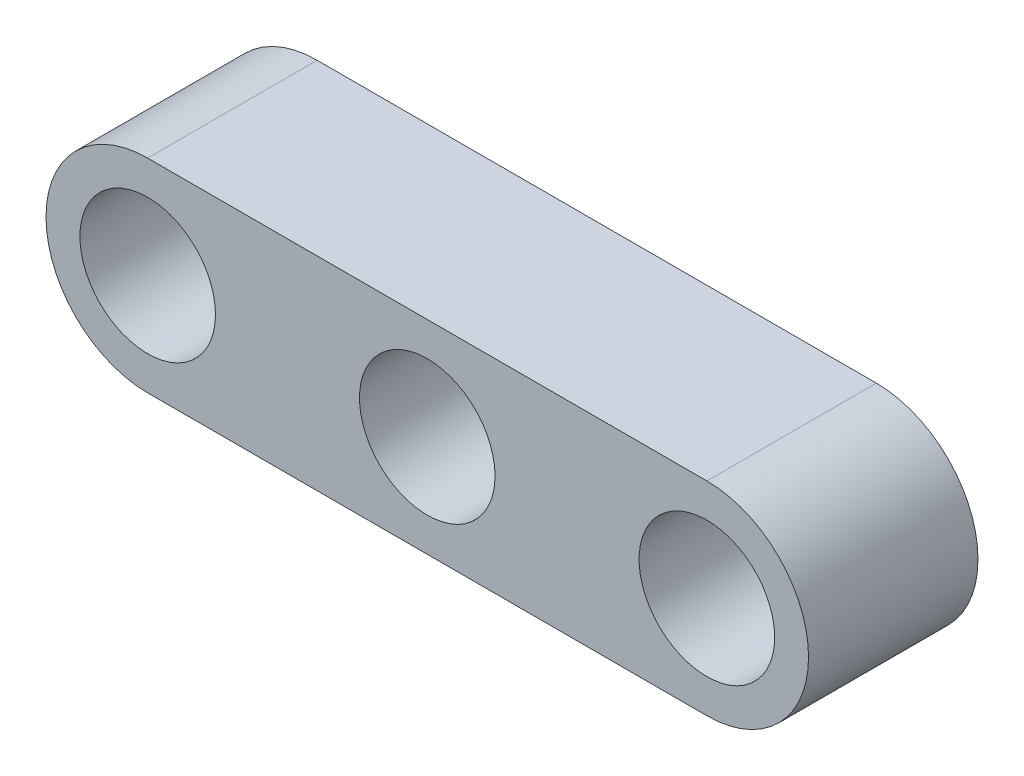
ISO-10303-21;
HEADER;
FILE_DESCRIPTION(('STEP AP214'),'2;1');
FILE_NAME('part.step','',(''),(''),'','','');
FILE_SCHEMA(('AUTOMOTIVE_DESIGN { 1 0 10303 214 1 1 1 1 }'));
ENDSEC;
DATA;
#1=APPLICATION_CONTEXT('core data for automotive mechanical design processes');
#2=APPLICATION_PROTOCOL_DEFINITION('international standard','automotive_design',2000,#1);
#3=PRODUCT_CONTEXT('',#1,'mechanical');
#4=PRODUCT('Part','Part','',(#3));
#5=PRODUCT_RELATED_PRODUCT_CATEGORY('part','',(#4));
#6=PRODUCT_DEFINITION_FORMATION('','',#4);
#7=PRODUCT_DEFINITION_CONTEXT('part definition',#1,'design');
#8=PRODUCT_DEFINITION('design','',#6,#7);
#9=PRODUCT_DEFINITION_SHAPE('','',#8);
#10=(LENGTH_UNIT() NAMED_UNIT(*) SI_UNIT(.MILLI.,.METRE.));
#11=(NAMED_UNIT(*) PLANE_ANGLE_UNIT() SI_UNIT($,.RADIAN.));
#12=(NAMED_UNIT(*) SI_UNIT($,.STERADIAN.) SOLID_ANGLE_UNIT());
#13=UNCERTAINTY_MEASURE_WITH_UNIT(LENGTH_MEASURE(1.E-05),#10,'distance_accuracy_value','');
#14=(GEOMETRIC_REPRESENTATION_CONTEXT(3) GLOBAL_UNCERTAINTY_ASSIGNED_CONTEXT((#13)) GLOBAL_UNIT_ASSIGNED_CONTEXT((#10,
#11,#12)) REPRESENTATION_CONTEXT('',''));
#15=CARTESIAN_POINT('',(0.,0.,0.));
#16=DIRECTION('',(0.,0.,1.));
#17=DIRECTION('',(1.,0.,0.));
#18=AXIS2_PLACEMENT_3D('',#15,#16,#17);
#19=CARTESIAN_POINT('',(-11.8163475395308,0.,5.));
#20=DIRECTION('',(0.,0.,1.));
#21=DIRECTION('',(1.,0.,0.));
#22=AXIS2_PLACEMENT_3D('',#19,#20,#21);
#23=PLANE('',#22);
#24=CARTESIAN_POINT('',(4.68365246046919,0.,5.));
#25=DIRECTION('',(0.,0.,1.));
#26=DIRECTION('',(1.,0.,0.));
#27=AXIS2_PLACEMENT_3D('',#24,#25,#26);
#28=CIRCLE('',#27,2.);
#29=CARTESIAN_POINT('',(6.68365246046919,0.,5.));
#30=VERTEX_POINT('',#29);
#31=EDGE_CURVE('E138',#30,#30,#28,.T.);
#32=ORIENTED_EDGE('',*,*,#31,.F.);
#33=EDGE_LOOP('',(#32));
#34=FACE_BOUND('',#33,.T.);
#35=CARTESIAN_POINT('',(-11.8163475395308,0.,5.));
#36=DIRECTION('',(0.,0.,1.));
#37=DIRECTION('',(1.,0.,0.));
#38=AXIS2_PLACEMENT_3D('',#35,#36,#37);
#39=CIRCLE('',#38,3.);
#40=CARTESIAN_POINT('',(-11.8163475395308,3.,5.));
#41=VERTEX_POINT('',#40);
#42=CARTESIAN_POINT('',(-11.8163475395308,-3.,5.));
#43=VERTEX_POINT('',#42);
#44=EDGE_CURVE('E96',#41,#43,#39,.T.);
#45=ORIENTED_EDGE('',*,*,#44,.T.);
#46=DIRECTION('',(1.,0.,0.));
#47=VECTOR('',#46,1.);
#48=CARTESIAN_POINT('',(-11.8163475395308,-3.,5.));
#49=LINE('',#48,#47);
#50=CARTESIAN_POINT('',(4.68365246046919,-3.,5.));
#51=VERTEX_POINT('',#50);
#52=EDGE_CURVE('E91',#43,#51,#49,.T.);
#53=ORIENTED_EDGE('',*,*,#52,.T.);
#54=CARTESIAN_POINT('',(4.68365246046919,0.,5.));
#55=DIRECTION('',(0.,0.,1.));
#56=DIRECTION('',(1.,0.,0.));
#57=AXIS2_PLACEMENT_3D('',#54,#55,#56);
#58=CIRCLE('',#57,3.);
#59=CARTESIAN_POINT('',(4.68365246046919,3.,5.));
#60=VERTEX_POINT('',#59);
#61=EDGE_CURVE('E94',#51,#60,#58,.T.);
#62=ORIENTED_EDGE('',*,*,#61,.T.);
#63=DIRECTION('',(-1.,0.,0.));
#64=VECTOR('',#63,1.);
#65=CARTESIAN_POINT('',(-11.8163475395308,3.,5.));
#66=LINE('',#65,#64);
#67=EDGE_CURVE('E61',#60,#41,#66,.T.);
#68=ORIENTED_EDGE('',*,*,#67,.T.);
#69=EDGE_LOOP('',(#45,#53,#62,#68));
#70=FACE_BOUND('',#69,.T.);
#71=CARTESIAN_POINT('',(-11.8163475395308,0.,5.));
#72=DIRECTION('',(0.,0.,1.));
#73=DIRECTION('',(1.,0.,0.));
#74=AXIS2_PLACEMENT_3D('',#71,#72,#73);
#75=CIRCLE('',#74,2.);
#76=CARTESIAN_POINT('',(-9.81634753953081,0.,5.));
#77=VERTEX_POINT('',#76);
#78=EDGE_CURVE('E116',#77,#77,#75,.T.);
#79=ORIENTED_EDGE('',*,*,#78,.F.);
#80=EDGE_LOOP('',(#79));
#81=FACE_BOUND('',#80,.T.);
#82=CARTESIAN_POINT('',(-3.56634753953081,0.,5.));
#83=DIRECTION('',(0.,0.,1.));
#84=DIRECTION('',(1.,0.,0.));
#85=AXIS2_PLACEMENT_3D('',#82,#83,#84);
#86=CIRCLE('',#85,2.);
#87=CARTESIAN_POINT('',(-1.56634753953081,0.,5.));
#88=VERTEX_POINT('',#87);
#89=EDGE_CURVE('E146',#88,#88,#86,.T.);
#90=ORIENTED_EDGE('',*,*,#89,.F.);
#91=EDGE_LOOP('',(#90));
#92=FACE_BOUND('',#91,.T.);
#93=ADVANCED_FACE('F43',(#34,#70,#81,#92),#23,.T.);
#94=CARTESIAN_POINT('',(-11.8163475395308,0.,0.));
#95=DIRECTION('',(0.,0.,1.));
#96=DIRECTION('',(1.,0.,0.));
#97=AXIS2_PLACEMENT_3D('',#94,#95,#96);
#98=PLANE('',#97);
#99=CARTESIAN_POINT('',(-11.8163475395308,0.,0.));
#100=DIRECTION('',(0.,0.,1.));
#101=DIRECTION('',(1.,0.,0.));
#102=AXIS2_PLACEMENT_3D('',#99,#100,#101);
#103=CIRCLE('',#102,3.);
#104=CARTESIAN_POINT('',(-11.8163475395308,3.,0.));
#105=VERTEX_POINT('',#104);
#106=CARTESIAN_POINT('',(-11.8163475395308,-3.,0.));
#107=VERTEX_POINT('',#106);
#108=EDGE_CURVE('E112',#105,#107,#103,.T.);
#109=ORIENTED_EDGE('',*,*,#108,.F.);
#110=DIRECTION('',(-1.,0.,0.));
#111=VECTOR('',#110,1.);
#112=CARTESIAN_POINT('',(-11.8163475395308,3.,0.));
#113=LINE('',#112,#111);
#114=CARTESIAN_POINT('',(4.68365246046919,3.,0.));
#115=VERTEX_POINT('',#114);
#116=EDGE_CURVE('E84',#115,#105,#113,.T.);
#117=ORIENTED_EDGE('',*,*,#116,.F.);
#118=CARTESIAN_POINT('',(4.68365246046919,0.,0.));
#119=DIRECTION('',(0.,0.,1.));
#120=DIRECTION('',(1.,0.,0.));
#121=AXIS2_PLACEMENT_3D('',#118,#119,#120);
#122=CIRCLE('',#121,3.);
#123=CARTESIAN_POINT('',(4.68365246046919,-3.,0.));
#124=VERTEX_POINT('',#123);
#125=EDGE_CURVE('E78',#124,#115,#122,.T.);
#126=ORIENTED_EDGE('',*,*,#125,.F.);
#127=DIRECTION('',(1.,0.,0.));
#128=VECTOR('',#127,1.);
#129=CARTESIAN_POINT('',(-11.8163475395308,-3.,0.));
#130=LINE('',#129,#128);
#131=EDGE_CURVE('E101',#107,#124,#130,.T.);
#132=ORIENTED_EDGE('',*,*,#131,.F.);
#133=EDGE_LOOP('',(#109,#117,#126,#132));
#134=FACE_BOUND('',#133,.T.);
#135=CARTESIAN_POINT('',(-11.8163475395308,0.,0.));
#136=DIRECTION('',(0.,0.,1.));
#137=DIRECTION('',(1.,0.,0.));
#138=AXIS2_PLACEMENT_3D('',#135,#136,#137);
#139=CIRCLE('',#138,2.);
#140=CARTESIAN_POINT('',(-9.81634753953081,0.,0.));
#141=VERTEX_POINT('',#140);
#142=EDGE_CURVE('E134',#141,#141,#139,.T.);
#143=ORIENTED_EDGE('',*,*,#142,.T.);
#144=EDGE_LOOP('',(#143));
#145=FACE_BOUND('',#144,.T.);
#146=CARTESIAN_POINT('',(4.68365246046919,0.,0.));
#147=DIRECTION('',(0.,0.,1.));
#148=DIRECTION('',(1.,0.,0.));
#149=AXIS2_PLACEMENT_3D('',#146,#147,#148);
#150=CIRCLE('',#149,2.);
#151=CARTESIAN_POINT('',(6.68365246046919,0.,0.));
#152=VERTEX_POINT('',#151);
#153=EDGE_CURVE('E142',#152,#152,#150,.T.);
#154=ORIENTED_EDGE('',*,*,#153,.T.);
#155=EDGE_LOOP('',(#154));
#156=FACE_BOUND('',#155,.T.);
#157=CARTESIAN_POINT('',(-3.56634753953081,0.,0.));
#158=DIRECTION('',(0.,0.,1.));
#159=DIRECTION('',(1.,0.,0.));
#160=AXIS2_PLACEMENT_3D('',#157,#158,#159);
#161=CIRCLE('',#160,2.);
#162=CARTESIAN_POINT('',(-1.56634753953081,0.,0.));
#163=VERTEX_POINT('',#162);
#164=EDGE_CURVE('E150',#163,#163,#161,.T.);
#165=ORIENTED_EDGE('',*,*,#164,.T.);
#166=EDGE_LOOP('',(#165));
#167=FACE_BOUND('',#166,.T.);
#168=ADVANCED_FACE('F129',(#134,#145,#156,#167),#98,.F.);
#169=CARTESIAN_POINT('',(-11.8163475395308,0.,5.));
#170=DIRECTION('',(0.,0.,-1.));
#171=DIRECTION('',(-1.,0.,0.));
#172=AXIS2_PLACEMENT_3D('',#169,#170,#171);
#173=CYLINDRICAL_SURFACE('',#172,3.);
#174=ORIENTED_EDGE('',*,*,#108,.T.);
#175=DIRECTION('',(0.,0.,-1.));
#176=VECTOR('',#175,1.);
#177=CARTESIAN_POINT('',(-11.8163475395308,-3.,5.));
#178=LINE('',#177,#176);
#179=EDGE_CURVE('E11',#43,#107,#178,.T.);
#180=ORIENTED_EDGE('',*,*,#179,.F.);
#181=ORIENTED_EDGE('',*,*,#44,.F.);
#182=DIRECTION('',(0.,0.,-1.));
#183=VECTOR('',#182,1.);
#184=CARTESIAN_POINT('',(-11.8163475395308,3.,5.));
#185=LINE('',#184,#183);
#186=EDGE_CURVE('E108',#41,#105,#185,.T.);
#187=ORIENTED_EDGE('',*,*,#186,.T.);
#188=EDGE_LOOP('',(#174,#180,#181,#187));
#189=FACE_BOUND('',#188,.T.);
#190=ADVANCED_FACE('F45',(#189),#173,.T.);
#191=CARTESIAN_POINT('',(-11.8163475395308,-3.,5.));
#192=DIRECTION('',(0.,1.,0.));
#193=DIRECTION('',(0.,0.,1.));
#194=AXIS2_PLACEMENT_3D('',#191,#192,#193);
#195=PLANE('',#194);
#196=ORIENTED_EDGE('',*,*,#131,.T.);
#197=DIRECTION('',(0.,0.,-1.));
#198=VECTOR('',#197,1.);
#199=CARTESIAN_POINT('',(4.68365246046919,-3.,5.));
#200=LINE('',#199,#198);
#201=EDGE_CURVE('E53',#51,#124,#200,.T.);
#202=ORIENTED_EDGE('',*,*,#201,.F.);
#203=ORIENTED_EDGE('',*,*,#52,.F.);
#204=ORIENTED_EDGE('',*,*,#179,.T.);
#205=EDGE_LOOP('',(#196,#202,#203,#204));
#206=FACE_BOUND('',#205,.T.);
#207=ADVANCED_FACE('F100',(#206),#195,.F.);
#208=CARTESIAN_POINT('',(4.68365246046919,0.,5.));
#209=DIRECTION('',(0.,0.,-1.));
#210=DIRECTION('',(-1.,0.,0.));
#211=AXIS2_PLACEMENT_3D('',#208,#209,#210);
#212=CYLINDRICAL_SURFACE('',#211,3.);
#213=ORIENTED_EDGE('',*,*,#125,.T.);
#214=DIRECTION('',(0.,0.,-1.));
#215=VECTOR('',#214,1.);
#216=CARTESIAN_POINT('',(4.68365246046919,3.,5.));
#217=LINE('',#216,#215);
#218=EDGE_CURVE('E103',#60,#115,#217,.T.);
#219=ORIENTED_EDGE('',*,*,#218,.F.);
#220=ORIENTED_EDGE('',*,*,#61,.F.);
#221=ORIENTED_EDGE('',*,*,#201,.T.);
#222=EDGE_LOOP('',(#213,#219,#220,#221));
#223=FACE_BOUND('',#222,.T.);
#224=ADVANCED_FACE('F104',(#223),#212,.T.);
#225=CARTESIAN_POINT('',(-11.8163475395308,3.,5.));
#226=DIRECTION('',(0.,-1.,0.));
#227=DIRECTION('',(0.,0.,-1.));
#228=AXIS2_PLACEMENT_3D('',#225,#226,#227);
#229=PLANE('',#228);
#230=ORIENTED_EDGE('',*,*,#116,.T.);
#231=ORIENTED_EDGE('',*,*,#186,.F.);
#232=ORIENTED_EDGE('',*,*,#67,.F.);
#233=ORIENTED_EDGE('',*,*,#218,.T.);
#234=EDGE_LOOP('',(#230,#231,#232,#233));
#235=FACE_BOUND('',#234,.T.);
#236=ADVANCED_FACE('F126',(#235),#229,.F.);
#237=CARTESIAN_POINT('',(-11.8163475395308,0.,5.));
#238=DIRECTION('',(0.,0.,-1.));
#239=DIRECTION('',(-1.,0.,0.));
#240=AXIS2_PLACEMENT_3D('',#237,#238,#239);
#241=CYLINDRICAL_SURFACE('',#240,2.);
#242=ORIENTED_EDGE('',*,*,#78,.T.);
#243=EDGE_LOOP('',(#242));
#244=FACE_BOUND('',#243,.T.);
#245=ORIENTED_EDGE('',*,*,#142,.F.);
#246=EDGE_LOOP('',(#245));
#247=FACE_BOUND('',#246,.T.);
#248=ADVANCED_FACE('F170',(#244,#247),#241,.F.);
#249=CARTESIAN_POINT('',(4.68365246046919,0.,5.));
#250=DIRECTION('',(0.,0.,-1.));
#251=DIRECTION('',(-1.,0.,0.));
#252=AXIS2_PLACEMENT_3D('',#249,#250,#251);
#253=CYLINDRICAL_SURFACE('',#252,2.);
#254=ORIENTED_EDGE('',*,*,#31,.T.);
#255=EDGE_LOOP('',(#254));
#256=FACE_BOUND('',#255,.T.);
#257=ORIENTED_EDGE('',*,*,#153,.F.);
#258=EDGE_LOOP('',(#257));
#259=FACE_BOUND('',#258,.T.);
#260=ADVANCED_FACE('F224',(#256,#259),#253,.F.);
#261=CARTESIAN_POINT('',(-3.56634753953081,0.,5.));
#262=DIRECTION('',(0.,0.,-1.));
#263=DIRECTION('',(-1.,0.,0.));
#264=AXIS2_PLACEMENT_3D('',#261,#262,#263);
#265=CYLINDRICAL_SURFACE('',#264,2.);
#266=ORIENTED_EDGE('',*,*,#89,.T.);
#267=EDGE_LOOP('',(#266));
#268=FACE_BOUND('',#267,.T.);
#269=ORIENTED_EDGE('',*,*,#164,.F.);
#270=EDGE_LOOP('',(#269));
#271=FACE_BOUND('',#270,.T.);
#272=ADVANCED_FACE('F158',(#268,#271),#265,.F.);
#273=CLOSED_SHELL('',(#93,#168,#190,#207,#224,#236,#248,#260,#272));
#274=MANIFOLD_SOLID_BREP('B2',#273);
#275=ADVANCED_BREP_SHAPE_REPRESENTATION('',(#18,#274),#14);
#276=SHAPE_DEFINITION_REPRESENTATION(#9,#275);
ENDSEC;
END-ISO-10303-21;
